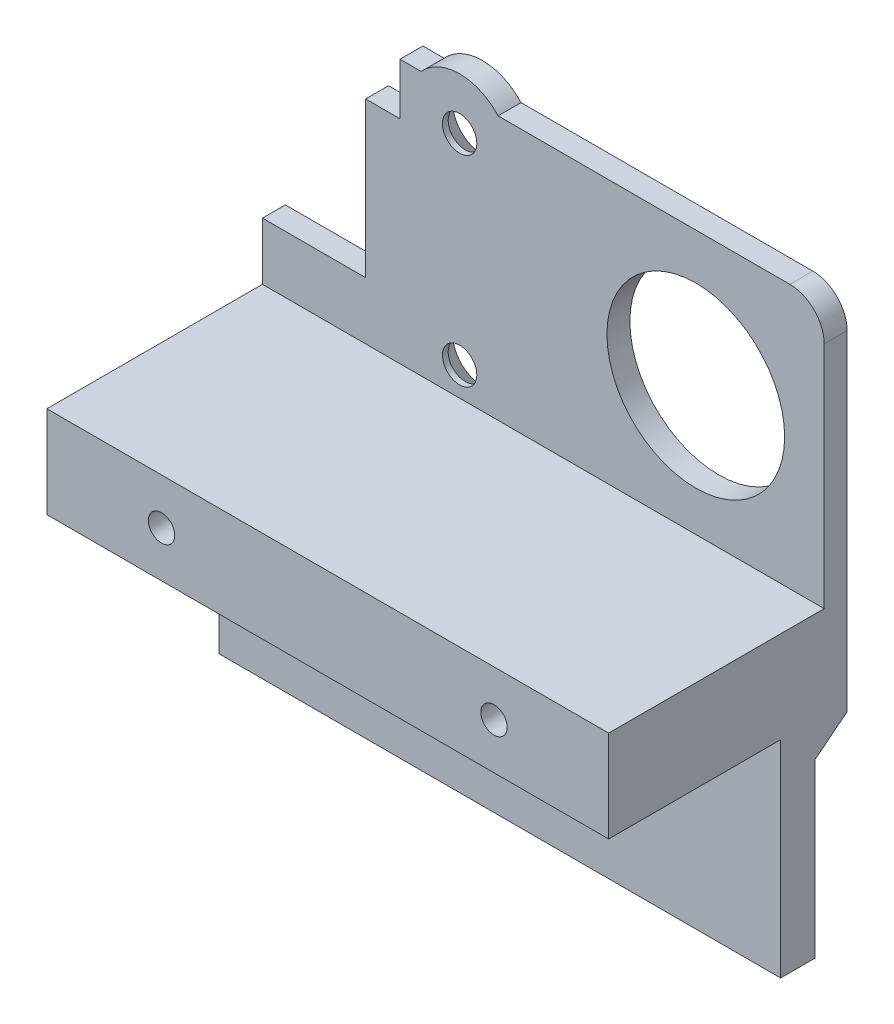
ISO-10303-21;
HEADER;
FILE_DESCRIPTION(('STEP AP214'),'2;1');
FILE_NAME('part.step','',(''),(''),'','','');
FILE_SCHEMA(('AUTOMOTIVE_DESIGN { 1 0 10303 214 1 1 1 1 }'));
ENDSEC;
DATA;
#1=APPLICATION_CONTEXT('core data for automotive mechanical design processes');
#2=APPLICATION_PROTOCOL_DEFINITION('international standard','automotive_design',2000,#1);
#3=PRODUCT_CONTEXT('',#1,'mechanical');
#4=PRODUCT('Part','Part','',(#3));
#5=PRODUCT_RELATED_PRODUCT_CATEGORY('part','',(#4));
#6=PRODUCT_DEFINITION_FORMATION('','',#4);
#7=PRODUCT_DEFINITION_CONTEXT('part definition',#1,'design');
#8=PRODUCT_DEFINITION('design','',#6,#7);
#9=PRODUCT_DEFINITION_SHAPE('','',#8);
#10=(LENGTH_UNIT() NAMED_UNIT(*) SI_UNIT(.MILLI.,.METRE.));
#11=(NAMED_UNIT(*) PLANE_ANGLE_UNIT() SI_UNIT($,.RADIAN.));
#12=(NAMED_UNIT(*) SI_UNIT($,.STERADIAN.) SOLID_ANGLE_UNIT());
#13=UNCERTAINTY_MEASURE_WITH_UNIT(LENGTH_MEASURE(1.E-05),#10,'distance_accuracy_value','');
#14=(GEOMETRIC_REPRESENTATION_CONTEXT(3) GLOBAL_UNCERTAINTY_ASSIGNED_CONTEXT((#13)) GLOBAL_UNIT_ASSIGNED_CONTEXT((#10,
#11,#12)) REPRESENTATION_CONTEXT('',''));
#15=CARTESIAN_POINT('',(0.,0.,0.));
#16=DIRECTION('',(0.,0.,1.));
#17=DIRECTION('',(1.,0.,0.));
#18=AXIS2_PLACEMENT_3D('',#15,#16,#17);
#19=CARTESIAN_POINT('',(0.,1.5,-5.8));
#20=DIRECTION('',(0.,-1.,0.));
#21=DIRECTION('',(0.,0.,-1.));
#22=AXIS2_PLACEMENT_3D('',#19,#20,#21);
#23=PLANE('',#22);
#24=DIRECTION('',(1.,0.,0.));
#25=VECTOR('',#24,1.);
#26=CARTESIAN_POINT('',(0.,1.5,-3.8));
#27=LINE('',#26,#25);
#28=CARTESIAN_POINT('',(-30.5,1.5,-3.8));
#29=VERTEX_POINT('',#28);
#30=CARTESIAN_POINT('',(18.5,1.5,-3.8));
#31=VERTEX_POINT('',#30);
#32=EDGE_CURVE('E294',#29,#31,#27,.T.);
#33=ORIENTED_EDGE('',*,*,#32,.F.);
#34=DIRECTION('',(0.,0.,1.));
#35=VECTOR('',#34,1.);
#36=CARTESIAN_POINT('',(-30.5,1.5,-5.8));
#37=LINE('',#36,#35);
#38=CARTESIAN_POINT('',(-30.5,1.5,15.));
#39=VERTEX_POINT('',#38);
#40=EDGE_CURVE('E353',#29,#39,#37,.T.);
#41=ORIENTED_EDGE('',*,*,#40,.T.);
#42=DIRECTION('',(1.,0.,0.));
#43=VECTOR('',#42,1.);
#44=CARTESIAN_POINT('',(0.,1.5,15.));
#45=LINE('',#44,#43);
#46=CARTESIAN_POINT('',(18.5,1.5,15.));
#47=VERTEX_POINT('',#46);
#48=EDGE_CURVE('E334',#39,#47,#45,.T.);
#49=ORIENTED_EDGE('',*,*,#48,.T.);
#50=DIRECTION('',(0.,0.,1.));
#51=VECTOR('',#50,1.);
#52=CARTESIAN_POINT('',(18.5,1.5,-5.8));
#53=LINE('',#52,#51);
#54=EDGE_CURVE('E347',#31,#47,#53,.T.);
#55=ORIENTED_EDGE('',*,*,#54,.F.);
#56=EDGE_LOOP('',(#33,#41,#49,#55));
#57=FACE_BOUND('',#56,.T.);
#58=ADVANCED_FACE('F136',(#57),#23,.F.);
#59=CARTESIAN_POINT('',(18.5,0.,-3.));
#60=DIRECTION('',(-1.,0.,0.));
#61=DIRECTION('',(0.,-1.,0.));
#62=AXIS2_PLACEMENT_3D('',#59,#60,#61);
#63=PLANE('',#62);
#64=DIRECTION('',(0.,-1.,0.));
#65=VECTOR('',#64,1.);
#66=CARTESIAN_POINT('',(18.5,0.,-5.8));
#67=LINE('',#66,#65);
#68=CARTESIAN_POINT('',(18.5,21.5,-5.8));
#69=VERTEX_POINT('',#68);
#70=CARTESIAN_POINT('',(18.5,-7.28947368421053,-5.8));
#71=VERTEX_POINT('',#70);
#72=EDGE_CURVE('E343',#69,#71,#67,.T.);
#73=ORIENTED_EDGE('',*,*,#72,.F.);
#74=DIRECTION('',(0.,0.,-1.));
#75=VECTOR('',#74,1.);
#76=CARTESIAN_POINT('',(18.5,21.5,-3.));
#77=LINE('',#76,#75);
#78=CARTESIAN_POINT('',(18.5,21.5,-3.8));
#79=VERTEX_POINT('',#78);
#80=EDGE_CURVE('E144',#69,#79,#77,.F.);
#81=ORIENTED_EDGE('',*,*,#80,.T.);
#82=DIRECTION('',(0.,-1.,0.));
#83=VECTOR('',#82,1.);
#84=CARTESIAN_POINT('',(18.5,0.,-3.8));
#85=LINE('',#84,#83);
#86=EDGE_CURVE('E292',#79,#31,#85,.T.);
#87=ORIENTED_EDGE('',*,*,#86,.T.);
#88=ORIENTED_EDGE('',*,*,#54,.T.);
#89=DIRECTION('',(0.,-1.,0.));
#90=VECTOR('',#89,1.);
#91=CARTESIAN_POINT('',(18.5,0.,15.));
#92=LINE('',#91,#90);
#93=CARTESIAN_POINT('',(18.5,-6.5,15.));
#94=VERTEX_POINT('',#93);
#95=EDGE_CURVE('E320',#47,#94,#92,.T.);
#96=ORIENTED_EDGE('',*,*,#95,.T.);
#97=DIRECTION('',(0.,0.,1.));
#98=VECTOR('',#97,1.);
#99=CARTESIAN_POINT('',(18.5,-6.5,-5.8));
#100=LINE('',#99,#98);
#101=CARTESIAN_POINT('',(18.5,-6.5,0.));
#102=VERTEX_POINT('',#101);
#103=EDGE_CURVE('E348',#102,#94,#100,.T.);
#104=ORIENTED_EDGE('',*,*,#103,.F.);
#105=DIRECTION('',(0.,-1.,0.));
#106=VECTOR('',#105,1.);
#107=CARTESIAN_POINT('',(18.5,0.,0.));
#108=LINE('',#107,#106);
#109=CARTESIAN_POINT('',(18.5,-24.5,0.));
#110=VERTEX_POINT('',#109);
#111=EDGE_CURVE('E373',#102,#110,#108,.T.);
#112=ORIENTED_EDGE('',*,*,#111,.T.);
#113=DIRECTION('',(0.,0.,1.));
#114=VECTOR('',#113,1.);
#115=CARTESIAN_POINT('',(18.5,-24.5,-3.));
#116=LINE('',#115,#114);
#117=CARTESIAN_POINT('',(18.5,-24.5,-3.));
#118=VERTEX_POINT('',#117);
#119=EDGE_CURVE('E386',#118,#110,#116,.T.);
#120=ORIENTED_EDGE('',*,*,#119,.F.);
#121=DIRECTION('',(0.,-1.,0.));
#122=VECTOR('',#121,1.);
#123=CARTESIAN_POINT('',(18.5,0.,-3.));
#124=LINE('',#123,#122);
#125=CARTESIAN_POINT('',(18.5,-9.5,-3.));
#126=VERTEX_POINT('',#125);
#127=EDGE_CURVE('E359',#126,#118,#124,.T.);
#128=ORIENTED_EDGE('',*,*,#127,.F.);
#129=DIRECTION('',(0.,0.619644288579021,-0.784882765533427));
#130=VECTOR('',#129,1.);
#131=CARTESIAN_POINT('',(18.5,-5.85238907849829,-7.62030716723549));
#132=LINE('',#131,#130);
#133=EDGE_CURVE('E404',#126,#71,#132,.T.);
#134=ORIENTED_EDGE('',*,*,#133,.T.);
#135=EDGE_LOOP('',(#73,#81,#87,#88,#96,#104,#112,#120,#128,#134));
#136=FACE_BOUND('',#135,.T.);
#137=ADVANCED_FACE('F438',(#136),#63,.F.);
#138=CARTESIAN_POINT('',(0.,-24.5,-3.));
#139=DIRECTION('',(0.,-1.,0.));
#140=DIRECTION('',(0.,0.,-1.));
#141=AXIS2_PLACEMENT_3D('',#138,#139,#140);
#142=PLANE('',#141);
#143=DIRECTION('',(1.,0.,0.));
#144=VECTOR('',#143,1.);
#145=CARTESIAN_POINT('',(0.,-24.5,0.));
#146=LINE('',#145,#144);
#147=CARTESIAN_POINT('',(-30.5,-24.5,0.));
#148=VERTEX_POINT('',#147);
#149=EDGE_CURVE('E381',#148,#110,#146,.T.);
#150=ORIENTED_EDGE('',*,*,#149,.F.);
#151=DIRECTION('',(0.,0.,1.));
#152=VECTOR('',#151,1.);
#153=CARTESIAN_POINT('',(-30.5,-24.5,-3.));
#154=LINE('',#153,#152);
#155=CARTESIAN_POINT('',(-30.5,-24.5,-3.));
#156=VERTEX_POINT('',#155);
#157=EDGE_CURVE('E370',#156,#148,#154,.T.);
#158=ORIENTED_EDGE('',*,*,#157,.F.);
#159=DIRECTION('',(1.,0.,0.));
#160=VECTOR('',#159,1.);
#161=CARTESIAN_POINT('',(0.,-24.5,-3.));
#162=LINE('',#161,#160);
#163=EDGE_CURVE('E364',#156,#118,#162,.T.);
#164=ORIENTED_EDGE('',*,*,#163,.T.);
#165=ORIENTED_EDGE('',*,*,#119,.T.);
#166=EDGE_LOOP('',(#150,#158,#164,#165));
#167=FACE_BOUND('',#166,.T.);
#168=ADVANCED_FACE('F444',(#167),#142,.T.);
#169=CARTESIAN_POINT('',(-30.5,0.,-3.));
#170=DIRECTION('',(-1.,0.,0.));
#171=DIRECTION('',(0.,-1.,0.));
#172=AXIS2_PLACEMENT_3D('',#169,#170,#171);
#173=PLANE('',#172);
#174=DIRECTION('',(0.,-1.,0.));
#175=VECTOR('',#174,1.);
#176=CARTESIAN_POINT('',(-30.5,0.,0.));
#177=LINE('',#176,#175);
#178=CARTESIAN_POINT('',(-30.5,-6.5,0.));
#179=VERTEX_POINT('',#178);
#180=EDGE_CURVE('E378',#179,#148,#177,.T.);
#181=ORIENTED_EDGE('',*,*,#180,.F.);
#182=DIRECTION('',(0.,0.,1.));
#183=VECTOR('',#182,1.);
#184=CARTESIAN_POINT('',(-30.5,-6.5,-5.8));
#185=LINE('',#184,#183);
#186=CARTESIAN_POINT('',(-30.5,-6.5,15.));
#187=VERTEX_POINT('',#186);
#188=EDGE_CURVE('E351',#179,#187,#185,.T.);
#189=ORIENTED_EDGE('',*,*,#188,.T.);
#190=DIRECTION('',(0.,-1.,0.));
#191=VECTOR('',#190,1.);
#192=CARTESIAN_POINT('',(-30.5,0.,15.));
#193=LINE('',#192,#191);
#194=EDGE_CURVE('E337',#39,#187,#193,.T.);
#195=ORIENTED_EDGE('',*,*,#194,.F.);
#196=ORIENTED_EDGE('',*,*,#40,.F.);
#197=DIRECTION('',(0.,-1.,0.));
#198=VECTOR('',#197,1.);
#199=CARTESIAN_POINT('',(-30.5,0.,-3.8));
#200=LINE('',#199,#198);
#201=CARTESIAN_POINT('',(-30.5,6.5,-3.8));
#202=VERTEX_POINT('',#201);
#203=EDGE_CURVE('E297',#202,#29,#200,.T.);
#204=ORIENTED_EDGE('',*,*,#203,.F.);
#205=DIRECTION('',(0.,0.,-1.));
#206=VECTOR('',#205,1.);
#207=CARTESIAN_POINT('',(-30.5,6.5,-3.8));
#208=LINE('',#207,#206);
#209=CARTESIAN_POINT('',(-30.5,6.5,-5.8));
#210=VERTEX_POINT('',#209);
#211=EDGE_CURVE('E325',#202,#210,#208,.T.);
#212=ORIENTED_EDGE('',*,*,#211,.T.);
#213=DIRECTION('',(0.,-1.,0.));
#214=VECTOR('',#213,1.);
#215=CARTESIAN_POINT('',(-30.5,0.,-5.8));
#216=LINE('',#215,#214);
#217=CARTESIAN_POINT('',(-30.5,-7.28947368421053,-5.8));
#218=VERTEX_POINT('',#217);
#219=EDGE_CURVE('E345',#210,#218,#216,.T.);
#220=ORIENTED_EDGE('',*,*,#219,.T.);
#221=DIRECTION('',(0.,-0.619644288579021,0.784882765533427));
#222=VECTOR('',#221,1.);
#223=CARTESIAN_POINT('',(-30.5,-9.5,-3.));
#224=LINE('',#223,#222);
#225=CARTESIAN_POINT('',(-30.5,-9.5,-3.));
#226=VERTEX_POINT('',#225);
#227=EDGE_CURVE('E410',#218,#226,#224,.T.);
#228=ORIENTED_EDGE('',*,*,#227,.T.);
#229=DIRECTION('',(0.,-1.,0.));
#230=VECTOR('',#229,1.);
#231=CARTESIAN_POINT('',(-30.5,0.,-3.));
#232=LINE('',#231,#230);
#233=EDGE_CURVE('E362',#226,#156,#232,.T.);
#234=ORIENTED_EDGE('',*,*,#233,.T.);
#235=ORIENTED_EDGE('',*,*,#157,.T.);
#236=EDGE_LOOP('',(#181,#189,#195,#196,#204,#212,#220,#228,#234,#235));
#237=FACE_BOUND('',#236,.T.);
#238=ADVANCED_FACE('F465',(#237),#173,.T.);
#239=CARTESIAN_POINT('',(-20.5,-14.,-3.));
#240=DIRECTION('',(0.,0.,1.));
#241=DIRECTION('',(1.,0.,0.));
#242=AXIS2_PLACEMENT_3D('',#239,#240,#241);
#243=CYLINDRICAL_SURFACE('',#242,1.75);
#244=CARTESIAN_POINT('',(-20.5,-14.,-3.));
#245=DIRECTION('',(0.,0.,1.));
#246=DIRECTION('',(1.,0.,0.));
#247=AXIS2_PLACEMENT_3D('',#244,#245,#246);
#248=CIRCLE('',#247,1.75);
#249=CARTESIAN_POINT('',(-18.75,-14.,-3.));
#250=VERTEX_POINT('',#249);
#251=EDGE_CURVE('E356',#250,#250,#248,.F.);
#252=ORIENTED_EDGE('',*,*,#251,.T.);
#253=EDGE_LOOP('',(#252));
#254=FACE_BOUND('',#253,.T.);
#255=CARTESIAN_POINT('',(-20.5,-14.,0.));
#256=DIRECTION('',(0.,0.,1.));
#257=DIRECTION('',(1.,0.,0.));
#258=AXIS2_PLACEMENT_3D('',#255,#256,#257);
#259=CIRCLE('',#258,1.75);
#260=CARTESIAN_POINT('',(-18.75,-14.,0.));
#261=VERTEX_POINT('',#260);
#262=EDGE_CURVE('E350',#261,#261,#259,.F.);
#263=ORIENTED_EDGE('',*,*,#262,.F.);
#264=EDGE_LOOP('',(#263));
#265=FACE_BOUND('',#264,.T.);
#266=ADVANCED_FACE('F461',(#254,#265),#243,.F.);
#267=CARTESIAN_POINT('',(8.5,-14.,-3.));
#268=DIRECTION('',(0.,0.,1.));
#269=DIRECTION('',(1.,0.,0.));
#270=AXIS2_PLACEMENT_3D('',#267,#268,#269);
#271=CYLINDRICAL_SURFACE('',#270,1.75);
#272=CARTESIAN_POINT('',(8.5,-14.,-3.));
#273=DIRECTION('',(0.,0.,1.));
#274=DIRECTION('',(1.,0.,0.));
#275=AXIS2_PLACEMENT_3D('',#272,#273,#274);
#276=CIRCLE('',#275,1.75);
#277=CARTESIAN_POINT('',(10.25,-14.,-3.));
#278=VERTEX_POINT('',#277);
#279=EDGE_CURVE('E367',#278,#278,#276,.F.);
#280=ORIENTED_EDGE('',*,*,#279,.T.);
#281=EDGE_LOOP('',(#280));
#282=FACE_BOUND('',#281,.T.);
#283=CARTESIAN_POINT('',(8.5,-14.,0.));
#284=DIRECTION('',(0.,0.,1.));
#285=DIRECTION('',(1.,0.,0.));
#286=AXIS2_PLACEMENT_3D('',#283,#284,#285);
#287=CIRCLE('',#286,1.75);
#288=CARTESIAN_POINT('',(10.25,-14.,0.));
#289=VERTEX_POINT('',#288);
#290=EDGE_CURVE('E360',#289,#289,#287,.F.);
#291=ORIENTED_EDGE('',*,*,#290,.F.);
#292=EDGE_LOOP('',(#291));
#293=FACE_BOUND('',#292,.T.);
#294=ADVANCED_FACE('F454',(#282,#293),#271,.F.);
#295=CARTESIAN_POINT('',(0.,0.,-3.));
#296=DIRECTION('',(0.,0.,1.));
#297=DIRECTION('',(1.,0.,0.));
#298=AXIS2_PLACEMENT_3D('',#295,#296,#297);
#299=PLANE('',#298);
#300=ORIENTED_EDGE('',*,*,#251,.F.);
#301=EDGE_LOOP('',(#300));
#302=FACE_BOUND('',#301,.T.);
#303=ORIENTED_EDGE('',*,*,#233,.F.);
#304=DIRECTION('',(1.,0.,0.));
#305=VECTOR('',#304,1.);
#306=CARTESIAN_POINT('',(0.,-9.5,-3.));
#307=LINE('',#306,#305);
#308=EDGE_CURVE('E401',#226,#126,#307,.T.);
#309=ORIENTED_EDGE('',*,*,#308,.T.);
#310=ORIENTED_EDGE('',*,*,#127,.T.);
#311=ORIENTED_EDGE('',*,*,#163,.F.);
#312=EDGE_LOOP('',(#303,#309,#310,#311));
#313=FACE_BOUND('',#312,.T.);
#314=ORIENTED_EDGE('',*,*,#279,.F.);
#315=EDGE_LOOP('',(#314));
#316=FACE_BOUND('',#315,.T.);
#317=ADVANCED_FACE('F450',(#302,#313,#316),#299,.F.);
#318=CARTESIAN_POINT('',(0.,0.,0.));
#319=DIRECTION('',(0.,0.,1.));
#320=DIRECTION('',(1.,0.,0.));
#321=AXIS2_PLACEMENT_3D('',#318,#319,#320);
#322=PLANE('',#321);
#323=ORIENTED_EDGE('',*,*,#262,.T.);
#324=EDGE_LOOP('',(#323));
#325=FACE_BOUND('',#324,.T.);
#326=ORIENTED_EDGE('',*,*,#111,.F.);
#327=DIRECTION('',(1.,0.,0.));
#328=VECTOR('',#327,1.);
#329=CARTESIAN_POINT('',(0.,-6.5,0.));
#330=LINE('',#329,#328);
#331=EDGE_CURVE('E376',#179,#102,#330,.T.);
#332=ORIENTED_EDGE('',*,*,#331,.F.);
#333=ORIENTED_EDGE('',*,*,#180,.T.);
#334=ORIENTED_EDGE('',*,*,#149,.T.);
#335=EDGE_LOOP('',(#326,#332,#333,#334));
#336=FACE_BOUND('',#335,.T.);
#337=ORIENTED_EDGE('',*,*,#290,.T.);
#338=EDGE_LOOP('',(#337));
#339=FACE_BOUND('',#338,.T.);
#340=ADVANCED_FACE('F453',(#325,#336,#339),#322,.T.);
#341=CARTESIAN_POINT('',(0.,-6.5,-5.8));
#342=DIRECTION('',(0.,-1.,0.));
#343=DIRECTION('',(0.,0.,-1.));
#344=AXIS2_PLACEMENT_3D('',#341,#342,#343);
#345=PLANE('',#344);
#346=ORIENTED_EDGE('',*,*,#188,.F.);
#347=ORIENTED_EDGE('',*,*,#331,.T.);
#348=ORIENTED_EDGE('',*,*,#103,.T.);
#349=DIRECTION('',(1.,0.,0.));
#350=VECTOR('',#349,1.);
#351=CARTESIAN_POINT('',(0.,-6.5,15.));
#352=LINE('',#351,#350);
#353=EDGE_CURVE('E340',#187,#94,#352,.T.);
#354=ORIENTED_EDGE('',*,*,#353,.F.);
#355=EDGE_LOOP('',(#346,#347,#348,#354));
#356=FACE_BOUND('',#355,.T.);
#357=ADVANCED_FACE('F448',(#356),#345,.T.);
#358=CARTESIAN_POINT('',(0.,0.,-5.8));
#359=DIRECTION('',(0.,0.,1.));
#360=DIRECTION('',(1.,0.,0.));
#361=AXIS2_PLACEMENT_3D('',#358,#359,#360);
#362=PLANE('',#361);
#363=CARTESIAN_POINT('',(-13.3,4.00000000000002,-5.8));
#364=DIRECTION('',(0.,0.,1.));
#365=DIRECTION('',(1.,0.,0.));
#366=AXIS2_PLACEMENT_3D('',#363,#364,#365);
#367=CIRCLE('',#366,2.59999999999999);
#368=CARTESIAN_POINT('',(-10.7,4.00000000000002,-5.8));
#369=VERTEX_POINT('',#368);
#370=EDGE_CURVE('E392',#369,#369,#367,.T.);
#371=ORIENTED_EDGE('',*,*,#370,.T.);
#372=EDGE_LOOP('',(#371));
#373=FACE_BOUND('',#372,.T.);
#374=CARTESIAN_POINT('',(-13.3,21.5,-5.8));
#375=DIRECTION('',(0.,0.,1.));
#376=DIRECTION('',(1.,0.,0.));
#377=AXIS2_PLACEMENT_3D('',#374,#375,#376);
#378=CIRCLE('',#377,2.60000000000002);
#379=CARTESIAN_POINT('',(-10.7,21.5,-5.8));
#380=VERTEX_POINT('',#379);
#381=EDGE_CURVE('E388',#380,#380,#378,.T.);
#382=ORIENTED_EDGE('',*,*,#381,.T.);
#383=EDGE_LOOP('',(#382));
#384=FACE_BOUND('',#383,.T.);
#385=DIRECTION('',(-1.,0.,0.));
#386=VECTOR('',#385,1.);
#387=CARTESIAN_POINT('',(0.,24.5,-5.8));
#388=LINE('',#387,#386);
#389=CARTESIAN_POINT('',(15.5,24.5,-5.8));
#390=VERTEX_POINT('',#389);
#391=CARTESIAN_POINT('',(-9.9458980337503,24.5,-5.8));
#392=VERTEX_POINT('',#391);
#393=EDGE_CURVE('E312',#390,#392,#388,.T.);
#394=ORIENTED_EDGE('',*,*,#393,.F.);
#395=CARTESIAN_POINT('',(15.5,21.5,-5.8));
#396=DIRECTION('',(0.,0.,1.));
#397=DIRECTION('',(1.,0.,0.));
#398=AXIS2_PLACEMENT_3D('',#395,#396,#397);
#399=CIRCLE('',#398,3.);
#400=EDGE_CURVE('E158',#390,#69,#399,.F.);
#401=ORIENTED_EDGE('',*,*,#400,.T.);
#402=ORIENTED_EDGE('',*,*,#72,.T.);
#403=DIRECTION('',(-1.,0.,0.));
#404=VECTOR('',#403,1.);
#405=CARTESIAN_POINT('',(0.,-7.28947368421053,-5.8));
#406=LINE('',#405,#404);
#407=EDGE_CURVE('E407',#71,#218,#406,.T.);
#408=ORIENTED_EDGE('',*,*,#407,.T.);
#409=ORIENTED_EDGE('',*,*,#219,.F.);
#410=DIRECTION('',(1.,0.,0.));
#411=VECTOR('',#410,1.);
#412=CARTESIAN_POINT('',(0.,6.5,-5.8));
#413=LINE('',#412,#411);
#414=CARTESIAN_POINT('',(-21.5,6.5,-5.8));
#415=VERTEX_POINT('',#414);
#416=EDGE_CURVE('E314',#210,#415,#413,.T.);
#417=ORIENTED_EDGE('',*,*,#416,.T.);
#418=DIRECTION('',(0.,-1.,0.));
#419=VECTOR('',#418,1.);
#420=CARTESIAN_POINT('',(-21.5,0.,-5.8));
#421=LINE('',#420,#419);
#422=CARTESIAN_POINT('',(-21.5,20.,-5.8));
#423=VERTEX_POINT('',#422);
#424=EDGE_CURVE('E283',#423,#415,#421,.T.);
#425=ORIENTED_EDGE('',*,*,#424,.F.);
#426=DIRECTION('',(1.,0.,0.));
#427=VECTOR('',#426,1.);
#428=CARTESIAN_POINT('',(0.,20.,-5.8));
#429=LINE('',#428,#427);
#430=CARTESIAN_POINT('',(-18.5,20.,-5.8));
#431=VERTEX_POINT('',#430);
#432=EDGE_CURVE('E280',#423,#431,#429,.T.);
#433=ORIENTED_EDGE('',*,*,#432,.T.);
#434=DIRECTION('',(0.,1.,0.));
#435=VECTOR('',#434,1.);
#436=CARTESIAN_POINT('',(-18.5,0.,-5.8));
#437=LINE('',#436,#435);
#438=CARTESIAN_POINT('',(-18.5,24.5,-5.8));
#439=VERTEX_POINT('',#438);
#440=EDGE_CURVE('E306',#431,#439,#437,.T.);
#441=ORIENTED_EDGE('',*,*,#440,.T.);
#442=DIRECTION('',(-1.,0.,0.));
#443=VECTOR('',#442,1.);
#444=CARTESIAN_POINT('',(0.,24.5000000000001,-5.8));
#445=LINE('',#444,#443);
#446=CARTESIAN_POINT('',(-16.6541019662497,24.5,-5.8));
#447=VERTEX_POINT('',#446);
#448=EDGE_CURVE('E271',#447,#439,#445,.T.);
#449=ORIENTED_EDGE('',*,*,#448,.F.);
#450=CARTESIAN_POINT('',(-13.3,21.5,-5.8));
#451=DIRECTION('',(0.,0.,1.));
#452=DIRECTION('',(1.,0.,0.));
#453=AXIS2_PLACEMENT_3D('',#450,#451,#452);
#454=CIRCLE('',#453,4.5);
#455=EDGE_CURVE('E310',#392,#447,#454,.T.);
#456=ORIENTED_EDGE('',*,*,#455,.F.);
#457=EDGE_LOOP('',(#394,#401,#402,#408,#409,#417,#425,#433,#441,#449,#456));
#458=FACE_BOUND('',#457,.T.);
#459=CARTESIAN_POINT('',(7.3,12.75,-5.8));
#460=DIRECTION('',(0.,0.,1.));
#461=DIRECTION('',(1.,0.,0.));
#462=AXIS2_PLACEMENT_3D('',#459,#460,#461);
#463=CIRCLE('',#462,7.75);
#464=CARTESIAN_POINT('',(15.05,12.75,-5.8));
#465=VERTEX_POINT('',#464);
#466=EDGE_CURVE('E286',#465,#465,#463,.T.);
#467=ORIENTED_EDGE('',*,*,#466,.T.);
#468=EDGE_LOOP('',(#467));
#469=FACE_BOUND('',#468,.T.);
#470=ADVANCED_FACE('F423',(#373,#384,#458,#469),#362,.F.);
#471=CARTESIAN_POINT('',(0.,0.,15.));
#472=DIRECTION('',(0.,0.,1.));
#473=DIRECTION('',(1.,0.,0.));
#474=AXIS2_PLACEMENT_3D('',#471,#472,#473);
#475=PLANE('',#474);
#476=CARTESIAN_POINT('',(8.5,-2.5,15.));
#477=DIRECTION('',(0.,0.,1.));
#478=DIRECTION('',(1.,0.,0.));
#479=AXIS2_PLACEMENT_3D('',#476,#477,#478);
#480=CIRCLE('',#479,1.15);
#481=CARTESIAN_POINT('',(9.65,-2.5,15.));
#482=VERTEX_POINT('',#481);
#483=EDGE_CURVE('E568',#482,#482,#480,.T.);
#484=ORIENTED_EDGE('',*,*,#483,.F.);
#485=EDGE_LOOP('',(#484));
#486=FACE_BOUND('',#485,.T.);
#487=CARTESIAN_POINT('',(-20.5,-2.5,15.));
#488=DIRECTION('',(0.,0.,1.));
#489=DIRECTION('',(1.,0.,0.));
#490=AXIS2_PLACEMENT_3D('',#487,#488,#489);
#491=CIRCLE('',#490,1.15);
#492=CARTESIAN_POINT('',(-19.35,-2.5,15.));
#493=VERTEX_POINT('',#492);
#494=EDGE_CURVE('E579',#493,#493,#491,.T.);
#495=ORIENTED_EDGE('',*,*,#494,.F.);
#496=EDGE_LOOP('',(#495));
#497=FACE_BOUND('',#496,.T.);
#498=ORIENTED_EDGE('',*,*,#95,.F.);
#499=ORIENTED_EDGE('',*,*,#48,.F.);
#500=ORIENTED_EDGE('',*,*,#194,.T.);
#501=ORIENTED_EDGE('',*,*,#353,.T.);
#502=EDGE_LOOP('',(#498,#499,#500,#501));
#503=FACE_BOUND('',#502,.T.);
#504=ADVANCED_FACE('F510',(#486,#497,#503),#475,.T.);
#505=CARTESIAN_POINT('',(-13.3,21.5,-3.8));
#506=DIRECTION('',(0.,0.,1.));
#507=DIRECTION('',(1.,0.,0.));
#508=AXIS2_PLACEMENT_3D('',#505,#506,#507);
#509=PLANE('',#508);
#510=CARTESIAN_POINT('',(-13.3,21.5,-3.8));
#511=DIRECTION('',(0.,0.,1.));
#512=DIRECTION('',(1.,0.,0.));
#513=AXIS2_PLACEMENT_3D('',#510,#511,#512);
#514=CIRCLE('',#513,1.5);
#515=CARTESIAN_POINT('',(-11.8,21.5,-3.8));
#516=VERTEX_POINT('',#515);
#517=EDGE_CURVE('E571',#516,#516,#514,.T.);
#518=ORIENTED_EDGE('',*,*,#517,.F.);
#519=EDGE_LOOP('',(#518));
#520=FACE_BOUND('',#519,.T.);
#521=ORIENTED_EDGE('',*,*,#86,.F.);
#522=CARTESIAN_POINT('',(15.5,21.5,-3.8));
#523=DIRECTION('',(0.,0.,1.));
#524=DIRECTION('',(1.,0.,0.));
#525=AXIS2_PLACEMENT_3D('',#522,#523,#524);
#526=CIRCLE('',#525,3.);
#527=CARTESIAN_POINT('',(15.5,24.5,-3.8));
#528=VERTEX_POINT('',#527);
#529=EDGE_CURVE('E12',#79,#528,#526,.T.);
#530=ORIENTED_EDGE('',*,*,#529,.T.);
#531=DIRECTION('',(-1.,0.,0.));
#532=VECTOR('',#531,1.);
#533=CARTESIAN_POINT('',(0.,24.5,-3.8));
#534=LINE('',#533,#532);
#535=CARTESIAN_POINT('',(-9.9458980337503,24.5,-3.8));
#536=VERTEX_POINT('',#535);
#537=EDGE_CURVE('E290',#528,#536,#534,.T.);
#538=ORIENTED_EDGE('',*,*,#537,.T.);
#539=CARTESIAN_POINT('',(-13.3,21.5,-3.8));
#540=DIRECTION('',(0.,0.,1.));
#541=DIRECTION('',(1.,0.,0.));
#542=AXIS2_PLACEMENT_3D('',#539,#540,#541);
#543=CIRCLE('',#542,4.5);
#544=CARTESIAN_POINT('',(-16.6541019662497,24.5,-3.8));
#545=VERTEX_POINT('',#544);
#546=EDGE_CURVE('E262',#536,#545,#543,.T.);
#547=ORIENTED_EDGE('',*,*,#546,.T.);
#548=DIRECTION('',(-1.,0.,0.));
#549=VECTOR('',#548,1.);
#550=CARTESIAN_POINT('',(0.,24.5000000000001,-3.8));
#551=LINE('',#550,#549);
#552=CARTESIAN_POINT('',(-18.5,24.5,-3.8));
#553=VERTEX_POINT('',#552);
#554=EDGE_CURVE('E253',#545,#553,#551,.T.);
#555=ORIENTED_EDGE('',*,*,#554,.T.);
#556=DIRECTION('',(0.,1.,0.));
#557=VECTOR('',#556,1.);
#558=CARTESIAN_POINT('',(-18.5,0.,-3.8));
#559=LINE('',#558,#557);
#560=CARTESIAN_POINT('',(-18.5,20.,-3.8));
#561=VERTEX_POINT('',#560);
#562=EDGE_CURVE('E259',#561,#553,#559,.T.);
#563=ORIENTED_EDGE('',*,*,#562,.F.);
#564=DIRECTION('',(1.,0.,0.));
#565=VECTOR('',#564,1.);
#566=CARTESIAN_POINT('',(0.,20.,-3.8));
#567=LINE('',#566,#565);
#568=CARTESIAN_POINT('',(-21.5,20.,-3.8));
#569=VERTEX_POINT('',#568);
#570=EDGE_CURVE('E276',#569,#561,#567,.T.);
#571=ORIENTED_EDGE('',*,*,#570,.F.);
#572=DIRECTION('',(0.,-1.,0.));
#573=VECTOR('',#572,1.);
#574=CARTESIAN_POINT('',(-21.5,0.,-3.8));
#575=LINE('',#574,#573);
#576=CARTESIAN_POINT('',(-21.5,6.5,-3.8));
#577=VERTEX_POINT('',#576);
#578=EDGE_CURVE('E303',#569,#577,#575,.T.);
#579=ORIENTED_EDGE('',*,*,#578,.T.);
#580=DIRECTION('',(1.,0.,0.));
#581=VECTOR('',#580,1.);
#582=CARTESIAN_POINT('',(0.,6.5,-3.8));
#583=LINE('',#582,#581);
#584=EDGE_CURVE('E300',#202,#577,#583,.T.);
#585=ORIENTED_EDGE('',*,*,#584,.F.);
#586=ORIENTED_EDGE('',*,*,#203,.T.);
#587=ORIENTED_EDGE('',*,*,#32,.T.);
#588=EDGE_LOOP('',(#521,#530,#538,#547,#555,#563,#571,#579,#585,#586,#587));
#589=FACE_BOUND('',#588,.T.);
#590=CARTESIAN_POINT('',(7.3,12.75,-3.8));
#591=DIRECTION('',(0.,0.,1.));
#592=DIRECTION('',(1.,0.,0.));
#593=AXIS2_PLACEMENT_3D('',#590,#591,#592);
#594=CIRCLE('',#593,7.75);
#595=CARTESIAN_POINT('',(15.05,12.75,-3.8));
#596=VERTEX_POINT('',#595);
#597=EDGE_CURVE('E308',#596,#596,#594,.T.);
#598=ORIENTED_EDGE('',*,*,#597,.F.);
#599=EDGE_LOOP('',(#598));
#600=FACE_BOUND('',#599,.T.);
#601=CARTESIAN_POINT('',(-13.3,4.00000000000002,-3.8));
#602=DIRECTION('',(0.,0.,1.));
#603=DIRECTION('',(1.,0.,0.));
#604=AXIS2_PLACEMENT_3D('',#601,#602,#603);
#605=CIRCLE('',#604,1.5);
#606=CARTESIAN_POINT('',(-11.8,4.00000000000002,-3.8));
#607=VERTEX_POINT('',#606);
#608=EDGE_CURVE('E567',#607,#607,#605,.T.);
#609=ORIENTED_EDGE('',*,*,#608,.F.);
#610=EDGE_LOOP('',(#609));
#611=FACE_BOUND('',#610,.T.);
#612=ADVANCED_FACE('F255',(#520,#589,#600,#611),#509,.T.);
#613=CARTESIAN_POINT('',(-18.5,0.,-3.8));
#614=DIRECTION('',(-1.,0.,0.));
#615=DIRECTION('',(0.,0.,1.));
#616=AXIS2_PLACEMENT_3D('',#613,#614,#615);
#617=PLANE('',#616);
#618=ORIENTED_EDGE('',*,*,#440,.F.);
#619=DIRECTION('',(0.,0.,-1.));
#620=VECTOR('',#619,1.);
#621=CARTESIAN_POINT('',(-18.5,20.,-3.8));
#622=LINE('',#621,#620);
#623=EDGE_CURVE('E279',#561,#431,#622,.T.);
#624=ORIENTED_EDGE('',*,*,#623,.F.);
#625=ORIENTED_EDGE('',*,*,#562,.T.);
#626=DIRECTION('',(0.,0.,-1.));
#627=VECTOR('',#626,1.);
#628=CARTESIAN_POINT('',(-18.5,24.5,-3.8));
#629=LINE('',#628,#627);
#630=EDGE_CURVE('E268',#553,#439,#629,.T.);
#631=ORIENTED_EDGE('',*,*,#630,.T.);
#632=EDGE_LOOP('',(#618,#624,#625,#631));
#633=FACE_BOUND('',#632,.T.);
#634=ADVANCED_FACE('F278',(#633),#617,.T.);
#635=CARTESIAN_POINT('',(0.,20.,-3.8));
#636=DIRECTION('',(0.,1.,0.));
#637=DIRECTION('',(0.,0.,1.));
#638=AXIS2_PLACEMENT_3D('',#635,#636,#637);
#639=PLANE('',#638);
#640=ORIENTED_EDGE('',*,*,#432,.F.);
#641=DIRECTION('',(0.,0.,-1.));
#642=VECTOR('',#641,1.);
#643=CARTESIAN_POINT('',(-21.5,20.,-3.8));
#644=LINE('',#643,#642);
#645=EDGE_CURVE('E321',#569,#423,#644,.T.);
#646=ORIENTED_EDGE('',*,*,#645,.F.);
#647=ORIENTED_EDGE('',*,*,#570,.T.);
#648=ORIENTED_EDGE('',*,*,#623,.T.);
#649=EDGE_LOOP('',(#640,#646,#647,#648));
#650=FACE_BOUND('',#649,.T.);
#651=ADVANCED_FACE('F523',(#650),#639,.T.);
#652=CARTESIAN_POINT('',(-21.5,0.,-3.8));
#653=DIRECTION('',(1.,0.,0.));
#654=DIRECTION('',(0.,1.,0.));
#655=AXIS2_PLACEMENT_3D('',#652,#653,#654);
#656=PLANE('',#655);
#657=ORIENTED_EDGE('',*,*,#424,.T.);
#658=DIRECTION('',(0.,0.,-1.));
#659=VECTOR('',#658,1.);
#660=CARTESIAN_POINT('',(-21.5,6.5,-3.8));
#661=LINE('',#660,#659);
#662=EDGE_CURVE('E323',#577,#415,#661,.T.);
#663=ORIENTED_EDGE('',*,*,#662,.F.);
#664=ORIENTED_EDGE('',*,*,#578,.F.);
#665=ORIENTED_EDGE('',*,*,#645,.T.);
#666=EDGE_LOOP('',(#657,#663,#664,#665));
#667=FACE_BOUND('',#666,.T.);
#668=ADVANCED_FACE('F524',(#667),#656,.F.);
#669=CARTESIAN_POINT('',(0.,6.5,-3.8));
#670=DIRECTION('',(0.,1.,0.));
#671=DIRECTION('',(0.,0.,1.));
#672=AXIS2_PLACEMENT_3D('',#669,#670,#671);
#673=PLANE('',#672);
#674=ORIENTED_EDGE('',*,*,#416,.F.);
#675=ORIENTED_EDGE('',*,*,#211,.F.);
#676=ORIENTED_EDGE('',*,*,#584,.T.);
#677=ORIENTED_EDGE('',*,*,#662,.T.);
#678=EDGE_LOOP('',(#674,#675,#676,#677));
#679=FACE_BOUND('',#678,.T.);
#680=ADVANCED_FACE('F435',(#679),#673,.T.);
#681=CARTESIAN_POINT('',(0.,24.5,-3.8));
#682=DIRECTION('',(0.,-1.,0.));
#683=DIRECTION('',(1.,0.,0.));
#684=AXIS2_PLACEMENT_3D('',#681,#682,#683);
#685=PLANE('',#684);
#686=ORIENTED_EDGE('',*,*,#537,.F.);
#687=DIRECTION('',(0.,0.,-1.));
#688=VECTOR('',#687,1.);
#689=CARTESIAN_POINT('',(15.5,24.5,-3.8));
#690=LINE('',#689,#688);
#691=EDGE_CURVE('E412',#528,#390,#690,.T.);
#692=ORIENTED_EDGE('',*,*,#691,.T.);
#693=ORIENTED_EDGE('',*,*,#393,.T.);
#694=DIRECTION('',(0.,0.,-1.));
#695=VECTOR('',#694,1.);
#696=CARTESIAN_POINT('',(-9.9458980337503,24.5,-3.8));
#697=LINE('',#696,#695);
#698=EDGE_CURVE('E328',#536,#392,#697,.T.);
#699=ORIENTED_EDGE('',*,*,#698,.F.);
#700=EDGE_LOOP('',(#686,#692,#693,#699));
#701=FACE_BOUND('',#700,.T.);
#702=ADVANCED_FACE('F418',(#701),#685,.F.);
#703=CARTESIAN_POINT('',(-13.3,21.5,-3.8));
#704=DIRECTION('',(0.,0.,-1.));
#705=DIRECTION('',(-1.,0.,0.));
#706=AXIS2_PLACEMENT_3D('',#703,#704,#705);
#707=CYLINDRICAL_SURFACE('',#706,4.5);
#708=ORIENTED_EDGE('',*,*,#455,.T.);
#709=DIRECTION('',(0.,0.,-1.));
#710=VECTOR('',#709,1.);
#711=CARTESIAN_POINT('',(-16.6541019662497,24.5,-3.8));
#712=LINE('',#711,#710);
#713=EDGE_CURVE('E275',#545,#447,#712,.T.);
#714=ORIENTED_EDGE('',*,*,#713,.F.);
#715=ORIENTED_EDGE('',*,*,#546,.F.);
#716=ORIENTED_EDGE('',*,*,#698,.T.);
#717=EDGE_LOOP('',(#708,#714,#715,#716));
#718=FACE_BOUND('',#717,.T.);
#719=ADVANCED_FACE('F426',(#718),#707,.T.);
#720=CARTESIAN_POINT('',(0.,24.5000000000001,-3.8));
#721=DIRECTION('',(0.,-1.,0.));
#722=DIRECTION('',(1.,0.,0.));
#723=AXIS2_PLACEMENT_3D('',#720,#721,#722);
#724=PLANE('',#723);
#725=ORIENTED_EDGE('',*,*,#448,.T.);
#726=ORIENTED_EDGE('',*,*,#630,.F.);
#727=ORIENTED_EDGE('',*,*,#554,.F.);
#728=ORIENTED_EDGE('',*,*,#713,.T.);
#729=EDGE_LOOP('',(#725,#726,#727,#728));
#730=FACE_BOUND('',#729,.T.);
#731=ADVANCED_FACE('F269',(#730),#724,.F.);
#732=CARTESIAN_POINT('',(7.3,12.75,-3.8));
#733=DIRECTION('',(0.,0.,-1.));
#734=DIRECTION('',(-1.,0.,0.));
#735=AXIS2_PLACEMENT_3D('',#732,#733,#734);
#736=CYLINDRICAL_SURFACE('',#735,7.75);
#737=ORIENTED_EDGE('',*,*,#597,.T.);
#738=EDGE_LOOP('',(#737));
#739=FACE_BOUND('',#738,.T.);
#740=ORIENTED_EDGE('',*,*,#466,.F.);
#741=EDGE_LOOP('',(#740));
#742=FACE_BOUND('',#741,.T.);
#743=ADVANCED_FACE('F433',(#739,#742),#736,.F.);
#744=CARTESIAN_POINT('',(-13.3,21.5,-3.8));
#745=DIRECTION('',(0.,0.,-1.));
#746=DIRECTION('',(-1.,0.,0.));
#747=AXIS2_PLACEMENT_3D('',#744,#745,#746);
#748=CYLINDRICAL_SURFACE('',#747,1.5);
#749=CARTESIAN_POINT('',(-13.3,21.5,-4.29999999999997));
#750=DIRECTION('',(0.,0.,1.));
#751=DIRECTION('',(1.,0.,0.));
#752=AXIS2_PLACEMENT_3D('',#749,#750,#751);
#753=CIRCLE('',#752,1.5);
#754=CARTESIAN_POINT('',(-11.8,21.5,-4.29999999999997));
#755=VERTEX_POINT('',#754);
#756=EDGE_CURVE('E398',#755,#755,#753,.F.);
#757=ORIENTED_EDGE('',*,*,#756,.T.);
#758=EDGE_LOOP('',(#757));
#759=FACE_BOUND('',#758,.T.);
#760=ORIENTED_EDGE('',*,*,#517,.T.);
#761=EDGE_LOOP('',(#760));
#762=FACE_BOUND('',#761,.T.);
#763=ADVANCED_FACE('F539',(#759,#762),#748,.F.);
#764=CARTESIAN_POINT('',(-13.3,4.00000000000002,-3.8));
#765=DIRECTION('',(0.,0.,-1.));
#766=DIRECTION('',(-1.,0.,0.));
#767=AXIS2_PLACEMENT_3D('',#764,#765,#766);
#768=CYLINDRICAL_SURFACE('',#767,1.5);
#769=CARTESIAN_POINT('',(-13.3,4.00000000000002,-4.29999999999999));
#770=DIRECTION('',(0.,0.,1.));
#771=DIRECTION('',(1.,0.,0.));
#772=AXIS2_PLACEMENT_3D('',#769,#770,#771);
#773=CIRCLE('',#772,1.5);
#774=CARTESIAN_POINT('',(-11.8,4.00000000000002,-4.29999999999999));
#775=VERTEX_POINT('',#774);
#776=EDGE_CURVE('E395',#775,#775,#773,.F.);
#777=ORIENTED_EDGE('',*,*,#776,.T.);
#778=EDGE_LOOP('',(#777));
#779=FACE_BOUND('',#778,.T.);
#780=ORIENTED_EDGE('',*,*,#608,.T.);
#781=EDGE_LOOP('',(#780));
#782=FACE_BOUND('',#781,.T.);
#783=ADVANCED_FACE('F543',(#779,#782),#768,.F.);
#784=CARTESIAN_POINT('',(-20.5,-2.5,5.));
#785=DIRECTION('',(0.,0.,1.));
#786=DIRECTION('',(1.,0.,0.));
#787=AXIS2_PLACEMENT_3D('',#784,#785,#786);
#788=CYLINDRICAL_SURFACE('',#787,1.15);
#789=CARTESIAN_POINT('',(-20.5,-2.5,5.));
#790=DIRECTION('',(0.,0.,1.));
#791=DIRECTION('',(1.,0.,0.));
#792=AXIS2_PLACEMENT_3D('',#789,#790,#791);
#793=CIRCLE('',#792,1.15);
#794=CARTESIAN_POINT('',(-19.35,-2.5,5.));
#795=VERTEX_POINT('',#794);
#796=EDGE_CURVE('E574',#795,#795,#793,.T.);
#797=ORIENTED_EDGE('',*,*,#796,.F.);
#798=EDGE_LOOP('',(#797));
#799=FACE_BOUND('',#798,.T.);
#800=ORIENTED_EDGE('',*,*,#494,.T.);
#801=EDGE_LOOP('',(#800));
#802=FACE_BOUND('',#801,.T.);
#803=ADVANCED_FACE('F547',(#799,#802),#788,.F.);
#804=CARTESIAN_POINT('',(-20.5,-2.5,5.));
#805=DIRECTION('',(0.,0.,1.));
#806=DIRECTION('',(1.,0.,0.));
#807=AXIS2_PLACEMENT_3D('',#804,#805,#806);
#808=PLANE('',#807);
#809=ORIENTED_EDGE('',*,*,#796,.T.);
#810=EDGE_LOOP('',(#809));
#811=FACE_BOUND('',#810,.T.);
#812=ADVANCED_FACE('F551',(#811),#808,.T.);
#813=CARTESIAN_POINT('',(8.5,-2.5,5.));
#814=DIRECTION('',(0.,0.,1.));
#815=DIRECTION('',(1.,0.,0.));
#816=AXIS2_PLACEMENT_3D('',#813,#814,#815);
#817=CYLINDRICAL_SURFACE('',#816,1.15);
#818=CARTESIAN_POINT('',(8.5,-2.5,5.));
#819=DIRECTION('',(0.,0.,1.));
#820=DIRECTION('',(1.,0.,0.));
#821=AXIS2_PLACEMENT_3D('',#818,#819,#820);
#822=CIRCLE('',#821,1.15);
#823=CARTESIAN_POINT('',(9.65,-2.5,5.));
#824=VERTEX_POINT('',#823);
#825=EDGE_CURVE('E566',#824,#824,#822,.T.);
#826=ORIENTED_EDGE('',*,*,#825,.F.);
#827=EDGE_LOOP('',(#826));
#828=FACE_BOUND('',#827,.T.);
#829=ORIENTED_EDGE('',*,*,#483,.T.);
#830=EDGE_LOOP('',(#829));
#831=FACE_BOUND('',#830,.T.);
#832=ADVANCED_FACE('F555',(#828,#831),#817,.F.);
#833=CARTESIAN_POINT('',(8.5,-2.5,5.));
#834=DIRECTION('',(0.,0.,1.));
#835=DIRECTION('',(1.,0.,0.));
#836=AXIS2_PLACEMENT_3D('',#833,#834,#835);
#837=PLANE('',#836);
#838=ORIENTED_EDGE('',*,*,#825,.T.);
#839=EDGE_LOOP('',(#838));
#840=FACE_BOUND('',#839,.T.);
#841=ADVANCED_FACE('F477',(#840),#837,.T.);
#842=CARTESIAN_POINT('',(-13.3,4.00000000000002,-5.8));
#843=DIRECTION('',(0.,0.,-1.));
#844=DIRECTION('',(-1.,0.,0.));
#845=AXIS2_PLACEMENT_3D('',#842,#843,#844);
#846=CONICAL_SURFACE('',#845,2.59999999999999,0.632748835002179);
#847=ORIENTED_EDGE('',*,*,#776,.F.);
#848=EDGE_LOOP('',(#847));
#849=FACE_BOUND('',#848,.T.);
#850=ORIENTED_EDGE('',*,*,#370,.F.);
#851=EDGE_LOOP('',(#850));
#852=FACE_BOUND('',#851,.T.);
#853=ADVANCED_FACE('F473',(#849,#852),#846,.F.);
#854=CARTESIAN_POINT('',(-13.3,21.5,-5.8));
#855=DIRECTION('',(0.,0.,-1.));
#856=DIRECTION('',(-1.,0.,0.));
#857=AXIS2_PLACEMENT_3D('',#854,#855,#856);
#858=CONICAL_SURFACE('',#857,2.60000000000002,0.632748835002181);
#859=ORIENTED_EDGE('',*,*,#756,.F.);
#860=EDGE_LOOP('',(#859));
#861=FACE_BOUND('',#860,.T.);
#862=ORIENTED_EDGE('',*,*,#381,.F.);
#863=EDGE_LOOP('',(#862));
#864=FACE_BOUND('',#863,.T.);
#865=ADVANCED_FACE('F476',(#861,#864),#858,.F.);
#866=CARTESIAN_POINT('',(0.,-9.5,-3.));
#867=DIRECTION('',(0.,0.784882765533426,0.619644288579021));
#868=DIRECTION('',(1.,0.,0.));
#869=AXIS2_PLACEMENT_3D('',#866,#867,#868);
#870=PLANE('',#869);
#871=ORIENTED_EDGE('',*,*,#227,.F.);
#872=ORIENTED_EDGE('',*,*,#407,.F.);
#873=ORIENTED_EDGE('',*,*,#133,.F.);
#874=ORIENTED_EDGE('',*,*,#308,.F.);
#875=EDGE_LOOP('',(#871,#872,#873,#874));
#876=FACE_BOUND('',#875,.T.);
#877=ADVANCED_FACE('F480',(#876),#870,.F.);
#878=CARTESIAN_POINT('',(15.5,21.5,-3.8));
#879=DIRECTION('',(0.,0.,-1.));
#880=DIRECTION('',(-1.,0.,0.));
#881=AXIS2_PLACEMENT_3D('',#878,#879,#880);
#882=CYLINDRICAL_SURFACE('',#881,3.);
#883=ORIENTED_EDGE('',*,*,#529,.F.);
#884=ORIENTED_EDGE('',*,*,#80,.F.);
#885=ORIENTED_EDGE('',*,*,#400,.F.);
#886=ORIENTED_EDGE('',*,*,#691,.F.);
#887=EDGE_LOOP('',(#883,#884,#885,#886));
#888=FACE_BOUND('',#887,.T.);
#889=ADVANCED_FACE('F138',(#888),#882,.T.);
#890=CLOSED_SHELL('',(#58,#137,#168,#238,#266,#294,#317,#340,#357,#470,#504,#612,#634,#651,#668,
#680,#702,#719,#731,#743,#763,#783,#803,#812,#832,#841,#853,#865,#877,#889));
#891=MANIFOLD_SOLID_BREP('B2',#890);
#892=ADVANCED_BREP_SHAPE_REPRESENTATION('',(#18,#891),#14);
#893=SHAPE_DEFINITION_REPRESENTATION(#9,#892);
ENDSEC;
END-ISO-10303-21;
